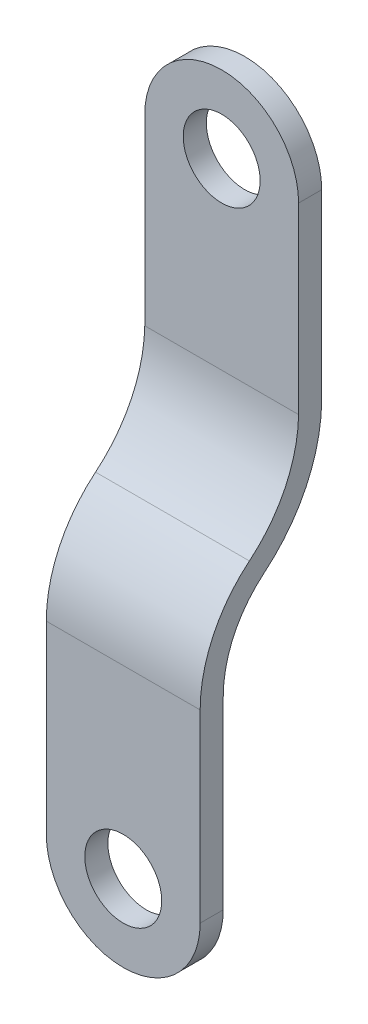
ISO-10303-21;
HEADER;
FILE_DESCRIPTION(('STEP AP214'),'2;1');
FILE_NAME('part.step','',(''),(''),'','','');
FILE_SCHEMA(('AUTOMOTIVE_DESIGN { 1 0 10303 214 1 1 1 1 }'));
ENDSEC;
DATA;
#1=APPLICATION_CONTEXT('core data for automotive mechanical design processes');
#2=APPLICATION_PROTOCOL_DEFINITION('international standard','automotive_design',2000,#1);
#3=PRODUCT_CONTEXT('',#1,'mechanical');
#4=PRODUCT('Part','Part','',(#3));
#5=PRODUCT_RELATED_PRODUCT_CATEGORY('part','',(#4));
#6=PRODUCT_DEFINITION_FORMATION('','',#4);
#7=PRODUCT_DEFINITION_CONTEXT('part definition',#1,'design');
#8=PRODUCT_DEFINITION('design','',#6,#7);
#9=PRODUCT_DEFINITION_SHAPE('','',#8);
#10=(LENGTH_UNIT() NAMED_UNIT(*) SI_UNIT(.MILLI.,.METRE.));
#11=(NAMED_UNIT(*) PLANE_ANGLE_UNIT() SI_UNIT($,.RADIAN.));
#12=(NAMED_UNIT(*) SI_UNIT($,.STERADIAN.) SOLID_ANGLE_UNIT());
#13=UNCERTAINTY_MEASURE_WITH_UNIT(LENGTH_MEASURE(1.E-05),#10,'distance_accuracy_value','');
#14=(GEOMETRIC_REPRESENTATION_CONTEXT(3) GLOBAL_UNCERTAINTY_ASSIGNED_CONTEXT((#13)) GLOBAL_UNIT_ASSIGNED_CONTEXT((#10,
#11,#12)) REPRESENTATION_CONTEXT('',''));
#15=CARTESIAN_POINT('',(0.,0.,0.));
#16=DIRECTION('',(0.,0.,1.));
#17=DIRECTION('',(1.,0.,0.));
#18=AXIS2_PLACEMENT_3D('',#15,#16,#17);
#19=CARTESIAN_POINT('',(-5.,0.,0.));
#20=DIRECTION('',(0.,0.,1.));
#21=DIRECTION('',(1.,0.,0.));
#22=AXIS2_PLACEMENT_3D('',#19,#20,#21);
#23=PLANE('',#22);
#24=CARTESIAN_POINT('',(0.,0.,0.));
#25=DIRECTION('',(0.,0.,1.));
#26=DIRECTION('',(1.,0.,0.));
#27=AXIS2_PLACEMENT_3D('',#24,#25,#26);
#28=CIRCLE('',#27,2.5);
#29=CARTESIAN_POINT('',(2.5,0.,0.));
#30=VERTEX_POINT('',#29);
#31=EDGE_CURVE('E293',#30,#30,#28,.T.);
#32=ORIENTED_EDGE('',*,*,#31,.F.);
#33=EDGE_LOOP('',(#32));
#34=FACE_BOUND('',#33,.T.);
#35=DIRECTION('',(0.,-1.,0.));
#36=VECTOR('',#35,1.);
#37=CARTESIAN_POINT('',(-5.,0.,0.));
#38=LINE('',#37,#36);
#39=CARTESIAN_POINT('',(-5.,12.,0.));
#40=VERTEX_POINT('',#39);
#41=CARTESIAN_POINT('',(-5.,0.,0.));
#42=VERTEX_POINT('',#41);
#43=EDGE_CURVE('E188',#40,#42,#38,.T.);
#44=ORIENTED_EDGE('',*,*,#43,.T.);
#45=CARTESIAN_POINT('',(0.,0.,0.));
#46=DIRECTION('',(0.,0.,1.));
#47=DIRECTION('',(1.,0.,0.));
#48=AXIS2_PLACEMENT_3D('',#45,#46,#47);
#49=CIRCLE('',#48,5.);
#50=CARTESIAN_POINT('',(5.,0.,0.));
#51=VERTEX_POINT('',#50);
#52=EDGE_CURVE('E217',#42,#51,#49,.T.);
#53=ORIENTED_EDGE('',*,*,#52,.T.);
#54=DIRECTION('',(0.,-1.,0.));
#55=VECTOR('',#54,1.);
#56=CARTESIAN_POINT('',(5.,0.,0.));
#57=LINE('',#56,#55);
#58=CARTESIAN_POINT('',(5.,12.,0.));
#59=VERTEX_POINT('',#58);
#60=EDGE_CURVE('E151',#59,#51,#57,.T.);
#61=ORIENTED_EDGE('',*,*,#60,.F.);
#62=DIRECTION('',(1.,0.,0.));
#63=VECTOR('',#62,1.);
#64=CARTESIAN_POINT('',(-5.,12.,0.));
#65=LINE('',#64,#63);
#66=EDGE_CURVE('E11',#40,#59,#65,.T.);
#67=ORIENTED_EDGE('',*,*,#66,.F.);
#68=EDGE_LOOP('',(#44,#53,#61,#67));
#69=FACE_BOUND('',#68,.T.);
#70=ADVANCED_FACE('F46',(#34,#69),#23,.T.);
#71=CARTESIAN_POINT('',(-5.,12.,-8.79743364808299));
#72=DIRECTION('',(1.,0.,0.));
#73=DIRECTION('',(0.,0.,-1.));
#74=AXIS2_PLACEMENT_3D('',#71,#72,#73);
#75=CYLINDRICAL_SURFACE('',#74,8.79743364808299);
#76=CARTESIAN_POINT('',(5.,12.,-8.79743364808299));
#77=DIRECTION('',(1.,0.,0.));
#78=DIRECTION('',(0.,0.,1.));
#79=AXIS2_PLACEMENT_3D('',#76,#77,#78);
#80=CIRCLE('',#79,8.79743364808299);
#81=CARTESIAN_POINT('',(5.,18.7870152016723,-3.2));
#82=VERTEX_POINT('',#81);
#83=EDGE_CURVE('E185',#82,#59,#80,.T.);
#84=ORIENTED_EDGE('',*,*,#83,.F.);
#85=DIRECTION('',(1.,0.,0.));
#86=VECTOR('',#85,1.);
#87=CARTESIAN_POINT('',(-5.,18.7870152016723,-3.2));
#88=LINE('',#87,#86);
#89=CARTESIAN_POINT('',(-5.,18.7870152016723,-3.2));
#90=VERTEX_POINT('',#89);
#91=EDGE_CURVE('E56',#90,#82,#88,.T.);
#92=ORIENTED_EDGE('',*,*,#91,.F.);
#93=CARTESIAN_POINT('',(-5.,12.,-8.79743364808299));
#94=DIRECTION('',(1.,0.,0.));
#95=DIRECTION('',(0.,0.,1.));
#96=AXIS2_PLACEMENT_3D('',#93,#94,#95);
#97=CIRCLE('',#96,8.79743364808299);
#98=EDGE_CURVE('E133',#90,#40,#97,.T.);
#99=ORIENTED_EDGE('',*,*,#98,.T.);
#100=ORIENTED_EDGE('',*,*,#66,.T.);
#101=EDGE_LOOP('',(#84,#92,#99,#100));
#102=FACE_BOUND('',#101,.T.);
#103=ADVANCED_FACE('F262',(#102),#75,.T.);
#104=CARTESIAN_POINT('',(-5.,25.5740304033446,2.39743364808299));
#105=DIRECTION('',(1.,0.,0.));
#106=DIRECTION('',(0.,0.,-1.));
#107=AXIS2_PLACEMENT_3D('',#104,#105,#106);
#108=CYLINDRICAL_SURFACE('',#107,8.79743364808299);
#109=CARTESIAN_POINT('',(5.,25.5740304033446,2.39743364808299));
#110=DIRECTION('',(-1.,0.,0.));
#111=DIRECTION('',(0.,0.,-1.));
#112=AXIS2_PLACEMENT_3D('',#109,#110,#111);
#113=CIRCLE('',#112,8.79743364808299);
#114=CARTESIAN_POINT('',(5.,25.4257193866256,-6.39874976489462));
#115=VERTEX_POINT('',#114);
#116=EDGE_CURVE('E119',#115,#82,#113,.T.);
#117=ORIENTED_EDGE('',*,*,#116,.F.);
#118=DIRECTION('',(1.,0.,0.));
#119=VECTOR('',#118,1.);
#120=CARTESIAN_POINT('',(-5.,25.4257193866256,-6.39874976489462));
#121=LINE('',#120,#119);
#122=CARTESIAN_POINT('',(-5.,25.4257193866256,-6.39874976489462));
#123=VERTEX_POINT('',#122);
#124=EDGE_CURVE('E114',#123,#115,#121,.T.);
#125=ORIENTED_EDGE('',*,*,#124,.F.);
#126=CARTESIAN_POINT('',(-5.,25.5740304033446,2.39743364808299));
#127=DIRECTION('',(-1.,0.,0.));
#128=DIRECTION('',(0.,0.,-1.));
#129=AXIS2_PLACEMENT_3D('',#126,#127,#128);
#130=CIRCLE('',#129,8.79743364808299);
#131=EDGE_CURVE('E117',#123,#90,#130,.T.);
#132=ORIENTED_EDGE('',*,*,#131,.T.);
#133=ORIENTED_EDGE('',*,*,#91,.T.);
#134=EDGE_LOOP('',(#117,#125,#132,#133));
#135=FACE_BOUND('',#134,.T.);
#136=ADVANCED_FACE('F116',(#135),#108,.F.);
#137=CARTESIAN_POINT('',(-5.,25.4257193866256,-6.39874976489462));
#138=DIRECTION('',(0.,0.,1.));
#139=DIRECTION('',(0.,-1.,0.));
#140=AXIS2_PLACEMENT_3D('',#137,#138,#139);
#141=PLANE('',#140);
#142=CARTESIAN_POINT('',(0.,37.3343581983901,-6.39874976489463));
#143=DIRECTION('',(0.,0.,1.));
#144=DIRECTION('',(0.,-1.,0.));
#145=AXIS2_PLACEMENT_3D('',#142,#143,#144);
#146=CIRCLE('',#145,2.5);
#147=CARTESIAN_POINT('',(0.,34.8343581983901,-6.39874976489463));
#148=VERTEX_POINT('',#147);
#149=EDGE_CURVE('E292',#148,#148,#146,.T.);
#150=ORIENTED_EDGE('',*,*,#149,.F.);
#151=EDGE_LOOP('',(#150));
#152=FACE_BOUND('',#151,.T.);
#153=DIRECTION('',(0.,-1.,0.));
#154=VECTOR('',#153,1.);
#155=CARTESIAN_POINT('',(5.,25.4257193866256,-6.39874976489462));
#156=LINE('',#155,#154);
#157=CARTESIAN_POINT('',(5.,37.3343581983901,-6.39874976489463));
#158=VERTEX_POINT('',#157);
#159=EDGE_CURVE('E180',#158,#115,#156,.T.);
#160=ORIENTED_EDGE('',*,*,#159,.F.);
#161=CARTESIAN_POINT('',(0.,37.3343581983901,-6.39874976489461));
#162=DIRECTION('',(0.,0.,1.));
#163=DIRECTION('',(1.,0.,0.));
#164=AXIS2_PLACEMENT_3D('',#161,#162,#163);
#165=CIRCLE('',#164,5.);
#166=CARTESIAN_POINT('',(-5.,37.3343581983901,-6.39874976489461));
#167=VERTEX_POINT('',#166);
#168=EDGE_CURVE('E138',#158,#167,#165,.T.);
#169=ORIENTED_EDGE('',*,*,#168,.T.);
#170=DIRECTION('',(0.,-1.,0.));
#171=VECTOR('',#170,1.);
#172=CARTESIAN_POINT('',(-5.,25.4257193866256,-6.39874976489462));
#173=LINE('',#172,#171);
#174=EDGE_CURVE('E132',#167,#123,#173,.T.);
#175=ORIENTED_EDGE('',*,*,#174,.T.);
#176=ORIENTED_EDGE('',*,*,#124,.T.);
#177=EDGE_LOOP('',(#160,#169,#175,#176));
#178=FACE_BOUND('',#177,.T.);
#179=ADVANCED_FACE('F137',(#152,#178),#141,.T.);
#180=CARTESIAN_POINT('',(-5.,25.4135721128255,-7.89874976489462));
#181=DIRECTION('',(0.,0.,-1.));
#182=DIRECTION('',(0.,1.,0.));
#183=AXIS2_PLACEMENT_3D('',#180,#181,#182);
#184=PLANE('',#183);
#185=CARTESIAN_POINT('',(0.,37.3343581983901,-7.89874976489463));
#186=DIRECTION('',(0.,0.,1.));
#187=DIRECTION('',(1.,0.,0.));
#188=AXIS2_PLACEMENT_3D('',#185,#186,#187);
#189=CIRCLE('',#188,2.5);
#190=CARTESIAN_POINT('',(2.5,37.3343581983901,-7.89874976489463));
#191=VERTEX_POINT('',#190);
#192=EDGE_CURVE('E300',#191,#191,#189,.T.);
#193=ORIENTED_EDGE('',*,*,#192,.T.);
#194=EDGE_LOOP('',(#193));
#195=FACE_BOUND('',#194,.T.);
#196=DIRECTION('',(0.,1.,0.));
#197=VECTOR('',#196,1.);
#198=CARTESIAN_POINT('',(-5.,25.4135721128255,-7.89874976489462));
#199=LINE('',#198,#197);
#200=CARTESIAN_POINT('',(-5.,25.4135721128255,-7.89874976489462));
#201=VERTEX_POINT('',#200);
#202=CARTESIAN_POINT('',(-5.,37.3343581983901,-7.89874976489463));
#203=VERTEX_POINT('',#202);
#204=EDGE_CURVE('E145',#201,#203,#199,.T.);
#205=ORIENTED_EDGE('',*,*,#204,.T.);
#206=CARTESIAN_POINT('',(0.,37.3343581983901,-7.89874976489463));
#207=DIRECTION('',(0.,0.,-1.));
#208=DIRECTION('',(0.,1.,0.));
#209=AXIS2_PLACEMENT_3D('',#206,#207,#208);
#210=CIRCLE('',#209,5.);
#211=CARTESIAN_POINT('',(5.,37.3343581983901,-7.89874976489463));
#212=VERTEX_POINT('',#211);
#213=EDGE_CURVE('E222',#212,#203,#210,.F.);
#214=ORIENTED_EDGE('',*,*,#213,.F.);
#215=DIRECTION('',(0.,1.,0.));
#216=VECTOR('',#215,1.);
#217=CARTESIAN_POINT('',(5.,25.4135721128255,-7.89874976489462));
#218=LINE('',#217,#216);
#219=CARTESIAN_POINT('',(5.,25.4135721128255,-7.89874976489462));
#220=VERTEX_POINT('',#219);
#221=EDGE_CURVE('E172',#220,#212,#218,.T.);
#222=ORIENTED_EDGE('',*,*,#221,.F.);
#223=DIRECTION('',(1.,0.,0.));
#224=VECTOR('',#223,1.);
#225=CARTESIAN_POINT('',(-5.,25.4135721128255,-7.89874976489462));
#226=LINE('',#225,#224);
#227=EDGE_CURVE('E125',#201,#220,#226,.T.);
#228=ORIENTED_EDGE('',*,*,#227,.F.);
#229=EDGE_LOOP('',(#205,#214,#222,#228));
#230=FACE_BOUND('',#229,.T.);
#231=ADVANCED_FACE('F252',(#195,#230),#184,.T.);
#232=CARTESIAN_POINT('',(-5.,25.5740304033446,2.39743364808299));
#233=DIRECTION('',(1.,0.,0.));
#234=DIRECTION('',(0.,0.,-1.));
#235=AXIS2_PLACEMENT_3D('',#232,#233,#234);
#236=CYLINDRICAL_SURFACE('',#235,10.297433648083);
#237=CARTESIAN_POINT('',(5.,25.5740304033446,2.39743364808299));
#238=DIRECTION('',(1.,0.,0.));
#239=DIRECTION('',(0.,0.,-1.));
#240=AXIS2_PLACEMENT_3D('',#237,#238,#239);
#241=CIRCLE('',#240,10.297433648083);
#242=CARTESIAN_POINT('',(5.,17.629800130806,-4.15438633674197));
#243=VERTEX_POINT('',#242);
#244=EDGE_CURVE('E168',#243,#220,#241,.T.);
#245=ORIENTED_EDGE('',*,*,#244,.F.);
#246=DIRECTION('',(1.,0.,0.));
#247=VECTOR('',#246,1.);
#248=CARTESIAN_POINT('',(-5.,17.629800130806,-4.15438633674197));
#249=LINE('',#248,#247);
#250=CARTESIAN_POINT('',(-5.,17.629800130806,-4.15438633674197));
#251=VERTEX_POINT('',#250);
#252=EDGE_CURVE('E194',#251,#243,#249,.T.);
#253=ORIENTED_EDGE('',*,*,#252,.F.);
#254=CARTESIAN_POINT('',(-5.,25.5740304033446,2.39743364808299));
#255=DIRECTION('',(1.,0.,0.));
#256=DIRECTION('',(0.,0.,-1.));
#257=AXIS2_PLACEMENT_3D('',#254,#255,#256);
#258=CIRCLE('',#257,10.297433648083);
#259=EDGE_CURVE('E242',#251,#201,#258,.T.);
#260=ORIENTED_EDGE('',*,*,#259,.T.);
#261=ORIENTED_EDGE('',*,*,#227,.T.);
#262=EDGE_LOOP('',(#245,#253,#260,#261));
#263=FACE_BOUND('',#262,.T.);
#264=ADVANCED_FACE('F257',(#263),#236,.T.);
#265=CARTESIAN_POINT('',(-5.,12.,-8.79743364808299));
#266=DIRECTION('',(1.,0.,0.));
#267=DIRECTION('',(0.,0.,-1.));
#268=AXIS2_PLACEMENT_3D('',#265,#266,#267);
#269=CYLINDRICAL_SURFACE('',#268,7.29743364808299);
#270=CARTESIAN_POINT('',(5.,12.,-8.79743364808299));
#271=DIRECTION('',(-1.,0.,0.));
#272=DIRECTION('',(0.,0.,1.));
#273=AXIS2_PLACEMENT_3D('',#270,#271,#272);
#274=CIRCLE('',#273,7.29743364808299);
#275=CARTESIAN_POINT('',(5.,12.,-1.5));
#276=VERTEX_POINT('',#275);
#277=EDGE_CURVE('E164',#276,#243,#274,.T.);
#278=ORIENTED_EDGE('',*,*,#277,.F.);
#279=DIRECTION('',(1.,0.,0.));
#280=VECTOR('',#279,1.);
#281=CARTESIAN_POINT('',(-5.,12.,-1.5));
#282=LINE('',#281,#280);
#283=CARTESIAN_POINT('',(-5.,12.,-1.5));
#284=VERTEX_POINT('',#283);
#285=EDGE_CURVE('E104',#284,#276,#282,.T.);
#286=ORIENTED_EDGE('',*,*,#285,.F.);
#287=CARTESIAN_POINT('',(-5.,12.,-8.79743364808299));
#288=DIRECTION('',(-1.,0.,0.));
#289=DIRECTION('',(0.,0.,1.));
#290=AXIS2_PLACEMENT_3D('',#287,#288,#289);
#291=CIRCLE('',#290,7.29743364808299);
#292=EDGE_CURVE('E239',#284,#251,#291,.T.);
#293=ORIENTED_EDGE('',*,*,#292,.T.);
#294=ORIENTED_EDGE('',*,*,#252,.T.);
#295=EDGE_LOOP('',(#278,#286,#293,#294));
#296=FACE_BOUND('',#295,.T.);
#297=ADVANCED_FACE('F205',(#296),#269,.F.);
#298=CARTESIAN_POINT('',(-5.,0.,-1.5));
#299=DIRECTION('',(0.,0.,-1.));
#300=DIRECTION('',(-1.,0.,0.));
#301=AXIS2_PLACEMENT_3D('',#298,#299,#300);
#302=PLANE('',#301);
#303=CARTESIAN_POINT('',(0.,0.,-1.5));
#304=DIRECTION('',(0.,0.,-1.));
#305=DIRECTION('',(-1.,0.,0.));
#306=AXIS2_PLACEMENT_3D('',#303,#304,#305);
#307=CIRCLE('',#306,2.5);
#308=CARTESIAN_POINT('',(-2.5,0.,-1.5));
#309=VERTEX_POINT('',#308);
#310=EDGE_CURVE('E49',#309,#309,#307,.T.);
#311=ORIENTED_EDGE('',*,*,#310,.F.);
#312=EDGE_LOOP('',(#311));
#313=FACE_BOUND('',#312,.T.);
#314=DIRECTION('',(0.,1.,0.));
#315=VECTOR('',#314,1.);
#316=CARTESIAN_POINT('',(5.,0.,-1.5));
#317=LINE('',#316,#315);
#318=CARTESIAN_POINT('',(5.,0.,-1.5));
#319=VERTEX_POINT('',#318);
#320=EDGE_CURVE('E160',#319,#276,#317,.T.);
#321=ORIENTED_EDGE('',*,*,#320,.F.);
#322=CARTESIAN_POINT('',(0.,0.,-1.5));
#323=DIRECTION('',(0.,0.,-1.));
#324=DIRECTION('',(-1.,0.,0.));
#325=AXIS2_PLACEMENT_3D('',#322,#323,#324);
#326=CIRCLE('',#325,5.);
#327=CARTESIAN_POINT('',(-5.,0.,-1.5));
#328=VERTEX_POINT('',#327);
#329=EDGE_CURVE('E156',#328,#319,#326,.F.);
#330=ORIENTED_EDGE('',*,*,#329,.F.);
#331=DIRECTION('',(0.,1.,0.));
#332=VECTOR('',#331,1.);
#333=CARTESIAN_POINT('',(-5.,0.,-1.5));
#334=LINE('',#333,#332);
#335=EDGE_CURVE('E204',#328,#284,#334,.T.);
#336=ORIENTED_EDGE('',*,*,#335,.T.);
#337=ORIENTED_EDGE('',*,*,#285,.T.);
#338=EDGE_LOOP('',(#321,#330,#336,#337));
#339=FACE_BOUND('',#338,.T.);
#340=ADVANCED_FACE('F201',(#313,#339),#302,.T.);
#341=CARTESIAN_POINT('',(-5.,12.,-8.79743364808299));
#342=DIRECTION('',(-1.,0.,0.));
#343=DIRECTION('',(0.,0.,1.));
#344=AXIS2_PLACEMENT_3D('',#341,#342,#343);
#345=PLANE('',#344);
#346=ORIENTED_EDGE('',*,*,#43,.F.);
#347=ORIENTED_EDGE('',*,*,#98,.F.);
#348=ORIENTED_EDGE('',*,*,#131,.F.);
#349=ORIENTED_EDGE('',*,*,#174,.F.);
#350=DIRECTION('',(0.,0.,1.));
#351=VECTOR('',#350,1.);
#352=CARTESIAN_POINT('',(-5.,37.3343581983901,-6.39874976489463));
#353=LINE('',#352,#351);
#354=EDGE_CURVE('E140',#203,#167,#353,.T.);
#355=ORIENTED_EDGE('',*,*,#354,.F.);
#356=ORIENTED_EDGE('',*,*,#204,.F.);
#357=ORIENTED_EDGE('',*,*,#259,.F.);
#358=ORIENTED_EDGE('',*,*,#292,.F.);
#359=ORIENTED_EDGE('',*,*,#335,.F.);
#360=DIRECTION('',(0.,0.,-1.));
#361=VECTOR('',#360,1.);
#362=CARTESIAN_POINT('',(-5.,0.,-1.5));
#363=LINE('',#362,#361);
#364=EDGE_CURVE('E234',#42,#328,#363,.T.);
#365=ORIENTED_EDGE('',*,*,#364,.F.);
#366=EDGE_LOOP('',(#346,#347,#348,#349,#355,#356,#357,#358,#359,#365));
#367=FACE_BOUND('',#366,.T.);
#368=ADVANCED_FACE('F129',(#367),#345,.T.);
#369=CARTESIAN_POINT('',(5.,12.,-8.79743364808299));
#370=DIRECTION('',(-1.,0.,0.));
#371=DIRECTION('',(0.,0.,1.));
#372=AXIS2_PLACEMENT_3D('',#369,#370,#371);
#373=PLANE('',#372);
#374=ORIENTED_EDGE('',*,*,#60,.T.);
#375=DIRECTION('',(0.,0.,-1.));
#376=VECTOR('',#375,1.);
#377=CARTESIAN_POINT('',(5.,0.,-1.5));
#378=LINE('',#377,#376);
#379=EDGE_CURVE('E155',#51,#319,#378,.T.);
#380=ORIENTED_EDGE('',*,*,#379,.T.);
#381=ORIENTED_EDGE('',*,*,#320,.T.);
#382=ORIENTED_EDGE('',*,*,#277,.T.);
#383=ORIENTED_EDGE('',*,*,#244,.T.);
#384=ORIENTED_EDGE('',*,*,#221,.T.);
#385=DIRECTION('',(0.,0.,1.));
#386=VECTOR('',#385,1.);
#387=CARTESIAN_POINT('',(5.,37.3343581983901,-6.39874976489463));
#388=LINE('',#387,#386);
#389=EDGE_CURVE('E176',#212,#158,#388,.T.);
#390=ORIENTED_EDGE('',*,*,#389,.T.);
#391=ORIENTED_EDGE('',*,*,#159,.T.);
#392=ORIENTED_EDGE('',*,*,#116,.T.);
#393=ORIENTED_EDGE('',*,*,#83,.T.);
#394=EDGE_LOOP('',(#374,#380,#381,#382,#383,#384,#390,#391,#392,#393));
#395=FACE_BOUND('',#394,.T.);
#396=ADVANCED_FACE('F208',(#395),#373,.F.);
#397=CARTESIAN_POINT('',(0.,0.,-15.642135623731));
#398=DIRECTION('',(0.,0.,1.));
#399=DIRECTION('',(1.,0.,0.));
#400=AXIS2_PLACEMENT_3D('',#397,#398,#399);
#401=CYLINDRICAL_SURFACE('',#400,5.);
#402=ORIENTED_EDGE('',*,*,#364,.T.);
#403=ORIENTED_EDGE('',*,*,#329,.T.);
#404=ORIENTED_EDGE('',*,*,#379,.F.);
#405=ORIENTED_EDGE('',*,*,#52,.F.);
#406=EDGE_LOOP('',(#402,#403,#404,#405));
#407=FACE_BOUND('',#406,.T.);
#408=ADVANCED_FACE('F215',(#407),#401,.T.);
#409=CARTESIAN_POINT('',(0.,37.3343581983901,-22.0408853886256));
#410=DIRECTION('',(0.,0.,1.));
#411=DIRECTION('',(1.,0.,0.));
#412=AXIS2_PLACEMENT_3D('',#409,#410,#411);
#413=CYLINDRICAL_SURFACE('',#412,5.);
#414=ORIENTED_EDGE('',*,*,#213,.T.);
#415=ORIENTED_EDGE('',*,*,#354,.T.);
#416=ORIENTED_EDGE('',*,*,#168,.F.);
#417=ORIENTED_EDGE('',*,*,#389,.F.);
#418=EDGE_LOOP('',(#414,#415,#416,#417));
#419=FACE_BOUND('',#418,.T.);
#420=ADVANCED_FACE('F323',(#419),#413,.T.);
#421=CARTESIAN_POINT('',(0.,0.,-7.89874976489463));
#422=DIRECTION('',(0.,0.,1.));
#423=DIRECTION('',(1.,0.,0.));
#424=AXIS2_PLACEMENT_3D('',#421,#422,#423);
#425=CYLINDRICAL_SURFACE('',#424,2.5);
#426=ORIENTED_EDGE('',*,*,#310,.T.);
#427=EDGE_LOOP('',(#426));
#428=FACE_BOUND('',#427,.T.);
#429=ORIENTED_EDGE('',*,*,#31,.T.);
#430=EDGE_LOOP('',(#429));
#431=FACE_BOUND('',#430,.T.);
#432=ADVANCED_FACE('F317',(#428,#431),#425,.F.);
#433=CARTESIAN_POINT('',(0.,37.3343581983901,-7.89874976489463));
#434=DIRECTION('',(0.,0.,1.));
#435=DIRECTION('',(1.,0.,0.));
#436=AXIS2_PLACEMENT_3D('',#433,#434,#435);
#437=CYLINDRICAL_SURFACE('',#436,2.5);
#438=ORIENTED_EDGE('',*,*,#149,.T.);
#439=EDGE_LOOP('',(#438));
#440=FACE_BOUND('',#439,.T.);
#441=ORIENTED_EDGE('',*,*,#192,.F.);
#442=EDGE_LOOP('',(#441));
#443=FACE_BOUND('',#442,.T.);
#444=ADVANCED_FACE('F315',(#440,#443),#437,.F.);
#445=CLOSED_SHELL('',(#70,#103,#136,#179,#231,#264,#297,#340,#368,#396,#408,#420,#432,#444));
#446=MANIFOLD_SOLID_BREP('B2',#445);
#447=ADVANCED_BREP_SHAPE_REPRESENTATION('',(#18,#446),#14);
#448=SHAPE_DEFINITION_REPRESENTATION(#9,#447);
ENDSEC;
END-ISO-10303-21;
